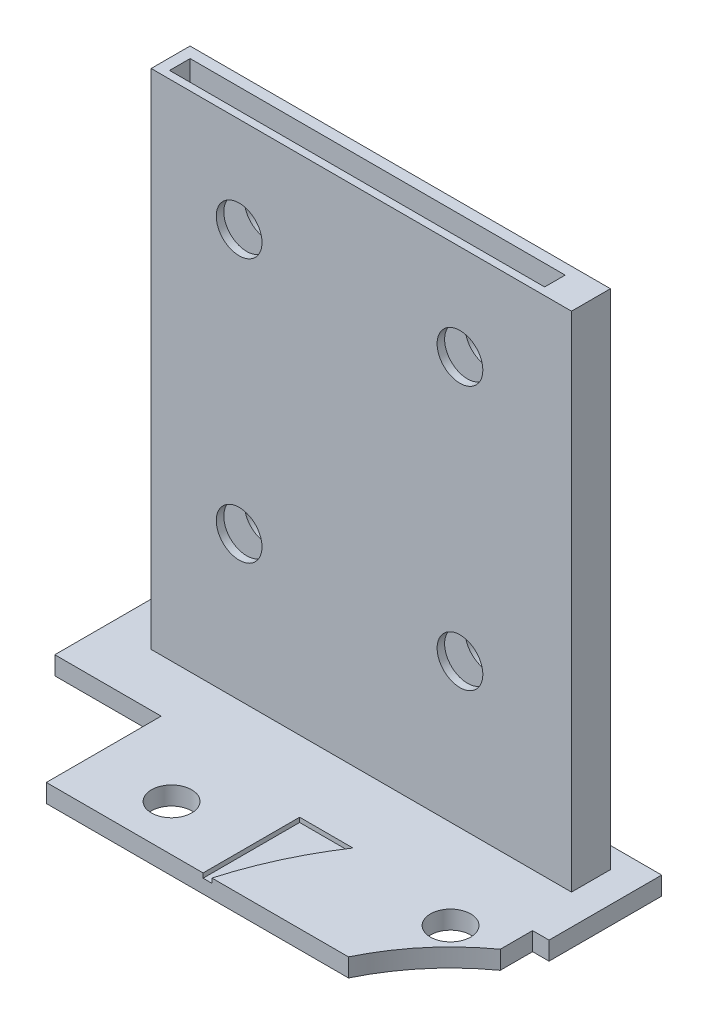
ISO-10303-21;
HEADER;
FILE_DESCRIPTION(('STEP AP214'),'2;1');
FILE_NAME('part.step','',(''),(''),'','','');
FILE_SCHEMA(('AUTOMOTIVE_DESIGN { 1 0 10303 214 1 1 1 1 }'));
ENDSEC;
DATA;
#1=APPLICATION_CONTEXT('core data for automotive mechanical design processes');
#2=APPLICATION_PROTOCOL_DEFINITION('international standard','automotive_design',2000,#1);
#3=PRODUCT_CONTEXT('',#1,'mechanical');
#4=PRODUCT('Part','Part','',(#3));
#5=PRODUCT_RELATED_PRODUCT_CATEGORY('part','',(#4));
#6=PRODUCT_DEFINITION_FORMATION('','',#4);
#7=PRODUCT_DEFINITION_CONTEXT('part definition',#1,'design');
#8=PRODUCT_DEFINITION('design','',#6,#7);
#9=PRODUCT_DEFINITION_SHAPE('','',#8);
#10=(LENGTH_UNIT() NAMED_UNIT(*) SI_UNIT(.MILLI.,.METRE.));
#11=(NAMED_UNIT(*) PLANE_ANGLE_UNIT() SI_UNIT($,.RADIAN.));
#12=(NAMED_UNIT(*) SI_UNIT($,.STERADIAN.) SOLID_ANGLE_UNIT());
#13=UNCERTAINTY_MEASURE_WITH_UNIT(LENGTH_MEASURE(1.E-05),#10,'distance_accuracy_value','');
#14=(GEOMETRIC_REPRESENTATION_CONTEXT(3) GLOBAL_UNCERTAINTY_ASSIGNED_CONTEXT((#13)) GLOBAL_UNIT_ASSIGNED_CONTEXT((#10,
#11,#12)) REPRESENTATION_CONTEXT('',''));
#15=CARTESIAN_POINT('',(0.,0.,0.));
#16=DIRECTION('',(0.,0.,1.));
#17=DIRECTION('',(1.,0.,0.));
#18=AXIS2_PLACEMENT_3D('',#15,#16,#17);
#19=CARTESIAN_POINT('',(3.,2.,0.));
#20=DIRECTION('',(0.,1.,0.));
#21=DIRECTION('',(0.,0.,1.));
#22=AXIS2_PLACEMENT_3D('',#19,#20,#21);
#23=PLANE('',#22);
#24=CARTESIAN_POINT('',(15.5,2.,-15.5));
#25=DIRECTION('',(0.,1.,0.));
#26=DIRECTION('',(0.,0.,1.));
#27=AXIS2_PLACEMENT_3D('',#24,#25,#26);
#28=CIRCLE('',#27,2.2);
#29=CARTESIAN_POINT('',(15.5,2.,-13.3));
#30=VERTEX_POINT('',#29);
#31=EDGE_CURVE('E53',#30,#30,#28,.T.);
#32=ORIENTED_EDGE('',*,*,#31,.F.);
#33=EDGE_LOOP('',(#32));
#34=FACE_BOUND('',#33,.T.);
#35=CARTESIAN_POINT('',(42.5,2.,-19.));
#36=DIRECTION('',(0.,1.,0.));
#37=DIRECTION('',(0.,0.,1.));
#38=AXIS2_PLACEMENT_3D('',#35,#36,#37);
#39=CIRCLE('',#38,2.2);
#40=CARTESIAN_POINT('',(42.5,2.,-16.8));
#41=VERTEX_POINT('',#40);
#42=EDGE_CURVE('E353',#41,#41,#39,.T.);
#43=ORIENTED_EDGE('',*,*,#42,.F.);
#44=EDGE_LOOP('',(#43));
#45=FACE_BOUND('',#44,.T.);
#46=DIRECTION('',(0.,0.,1.));
#47=VECTOR('',#46,1.);
#48=CARTESIAN_POINT('',(47.4659600941924,2.,-35.3135345713538));
#49=LINE('',#48,#47);
#50=CARTESIAN_POINT('',(47.4659600941924,2.,-23.));
#51=VERTEX_POINT('',#50);
#52=CARTESIAN_POINT('',(47.4659600941924,2.,-19.4690966385757));
#53=VERTEX_POINT('',#52);
#54=EDGE_CURVE('E295',#51,#53,#49,.T.);
#55=ORIENTED_EDGE('',*,*,#54,.F.);
#56=DIRECTION('',(1.,0.,0.));
#57=VECTOR('',#56,1.);
#58=CARTESIAN_POINT('',(6.86192523723633,2.,-23.));
#59=LINE('',#58,#57);
#60=CARTESIAN_POINT('',(49.26519911665,2.,-23.));
#61=VERTEX_POINT('',#60);
#62=EDGE_CURVE('E279',#51,#61,#59,.T.);
#63=ORIENTED_EDGE('',*,*,#62,.T.);
#64=DIRECTION('',(0.,0.,-1.));
#65=VECTOR('',#64,1.);
#66=CARTESIAN_POINT('',(49.26519911665,2.,-23.));
#67=LINE('',#66,#65);
#68=CARTESIAN_POINT('',(49.26519911665,2.,-35.3135345713538));
#69=VERTEX_POINT('',#68);
#70=EDGE_CURVE('E258',#61,#69,#67,.T.);
#71=ORIENTED_EDGE('',*,*,#70,.T.);
#72=DIRECTION('',(-1.,0.,0.));
#73=VECTOR('',#72,1.);
#74=CARTESIAN_POINT('',(47.4659600941924,2.,-35.3135345713538));
#75=LINE('',#74,#73);
#76=CARTESIAN_POINT('',(-4.76341799432753,2.,-35.3135345713538));
#77=VERTEX_POINT('',#76);
#78=EDGE_CURVE('E274',#69,#77,#75,.T.);
#79=ORIENTED_EDGE('',*,*,#78,.T.);
#80=DIRECTION('',(0.,0.,1.));
#81=VECTOR('',#80,1.);
#82=CARTESIAN_POINT('',(-4.76341799432753,2.,-35.3135345713538));
#83=LINE('',#82,#81);
#84=CARTESIAN_POINT('',(-4.76341799432753,2.,-23.));
#85=VERTEX_POINT('',#84);
#86=EDGE_CURVE('E276',#77,#85,#83,.T.);
#87=ORIENTED_EDGE('',*,*,#86,.T.);
#88=CARTESIAN_POINT('',(6.86192523723633,2.,-23.));
#89=VERTEX_POINT('',#88);
#90=EDGE_CURVE('E280',#85,#89,#59,.T.);
#91=ORIENTED_EDGE('',*,*,#90,.T.);
#92=DIRECTION('',(0.,0.,-1.));
#93=VECTOR('',#92,1.);
#94=CARTESIAN_POINT('',(6.86192523723633,2.,-10.4481568727972));
#95=LINE('',#94,#93);
#96=CARTESIAN_POINT('',(6.86192523723633,2.,-10.4481568727972));
#97=VERTEX_POINT('',#96);
#98=EDGE_CURVE('E301',#97,#89,#95,.T.);
#99=ORIENTED_EDGE('',*,*,#98,.F.);
#100=DIRECTION('',(-1.,0.,0.));
#101=VECTOR('',#100,1.);
#102=CARTESIAN_POINT('',(47.4659600941924,2.,-10.4481568727972));
#103=LINE('',#102,#101);
#104=CARTESIAN_POINT('',(24.,2.,-10.4481568727972));
#105=VERTEX_POINT('',#104);
#106=EDGE_CURVE('E297',#105,#97,#103,.T.);
#107=ORIENTED_EDGE('',*,*,#106,.F.);
#108=DIRECTION('',(0.,0.,-1.));
#109=VECTOR('',#108,1.);
#110=CARTESIAN_POINT('',(24.,2.,-25.8416358230333));
#111=LINE('',#110,#109);
#112=CARTESIAN_POINT('',(24.,2.,-21.));
#113=VERTEX_POINT('',#112);
#114=EDGE_CURVE('E333',#105,#113,#111,.T.);
#115=ORIENTED_EDGE('',*,*,#114,.T.);
#116=DIRECTION('',(1.,0.,0.));
#117=VECTOR('',#116,1.);
#118=CARTESIAN_POINT('',(11.8171021910919,2.,-21.));
#119=LINE('',#118,#117);
#120=CARTESIAN_POINT('',(29.8298247557738,2.,-21.));
#121=VERTEX_POINT('',#120);
#122=EDGE_CURVE('E335',#113,#121,#119,.T.);
#123=ORIENTED_EDGE('',*,*,#122,.T.);
#124=CARTESIAN_POINT('',(61.5,2.,0.));
#125=DIRECTION('',(0.,1.,0.));
#126=DIRECTION('',(0.,0.,1.));
#127=AXIS2_PLACEMENT_3D('',#124,#125,#126);
#128=CIRCLE('',#127,38.);
#129=CARTESIAN_POINT('',(24.9645922704916,2.,-10.4481568727972));
#130=VERTEX_POINT('',#129);
#131=EDGE_CURVE('E328',#121,#130,#128,.T.);
#132=ORIENTED_EDGE('',*,*,#131,.T.);
#133=CARTESIAN_POINT('',(39.8936116400399,2.,-10.4481568727972));
#134=VERTEX_POINT('',#133);
#135=EDGE_CURVE('E300',#134,#130,#103,.T.);
#136=ORIENTED_EDGE('',*,*,#135,.F.);
#137=CARTESIAN_POINT('',(61.5,2.,0.));
#138=DIRECTION('',(0.,1.,0.));
#139=DIRECTION('',(0.,0.,1.));
#140=AXIS2_PLACEMENT_3D('',#137,#138,#139);
#141=CIRCLE('',#140,24.);
#142=EDGE_CURVE('E339',#53,#134,#141,.T.);
#143=ORIENTED_EDGE('',*,*,#142,.F.);
#144=EDGE_LOOP('',(#55,#63,#71,#79,#87,#91,#99,#107,#115,#123,#132,#136,#143));
#145=FACE_BOUND('',#144,.T.);
#146=DIRECTION('',(1.,0.,0.));
#147=VECTOR('',#146,1.);
#148=CARTESIAN_POINT('',(45.9530538750969,2.,-28.7697129723269));
#149=LINE('',#148,#147);
#150=CARTESIAN_POINT('',(0.,2.,-28.7697129723269));
#151=VERTEX_POINT('',#150);
#152=CARTESIAN_POINT('',(45.9530538750969,2.,-28.7697129723269));
#153=VERTEX_POINT('',#152);
#154=EDGE_CURVE('E245',#151,#153,#149,.T.);
#155=ORIENTED_EDGE('',*,*,#154,.F.);
#156=DIRECTION('',(0.,0.,1.));
#157=VECTOR('',#156,1.);
#158=CARTESIAN_POINT('',(0.,2.,-28.7697129723269));
#159=LINE('',#158,#157);
#160=CARTESIAN_POINT('',(0.,2.,-33.0226542261013));
#161=VERTEX_POINT('',#160);
#162=EDGE_CURVE('E208',#161,#151,#159,.T.);
#163=ORIENTED_EDGE('',*,*,#162,.F.);
#164=DIRECTION('',(-1.,0.,0.));
#165=VECTOR('',#164,1.);
#166=CARTESIAN_POINT('',(0.,2.,-33.0226542261013));
#167=LINE('',#166,#165);
#168=CARTESIAN_POINT('',(45.9530538750969,2.,-33.0226542261013));
#169=VERTEX_POINT('',#168);
#170=EDGE_CURVE('E236',#169,#161,#167,.T.);
#171=ORIENTED_EDGE('',*,*,#170,.F.);
#172=DIRECTION('',(0.,0.,-1.));
#173=VECTOR('',#172,1.);
#174=CARTESIAN_POINT('',(45.9530538750969,2.,-33.0226542261013));
#175=LINE('',#174,#173);
#176=EDGE_CURVE('E247',#153,#169,#175,.T.);
#177=ORIENTED_EDGE('',*,*,#176,.F.);
#178=EDGE_LOOP('',(#155,#163,#171,#177));
#179=FACE_BOUND('',#178,.T.);
#180=ADVANCED_FACE('F44',(#34,#45,#145,#179),#23,.T.);
#181=CARTESIAN_POINT('',(3.,0.,0.));
#182=DIRECTION('',(0.,1.,0.));
#183=DIRECTION('',(0.,0.,1.));
#184=AXIS2_PLACEMENT_3D('',#181,#182,#183);
#185=PLANE('',#184);
#186=DIRECTION('',(0.,0.,-1.));
#187=VECTOR('',#186,1.);
#188=CARTESIAN_POINT('',(6.86192523723633,0.,0.));
#189=LINE('',#188,#187);
#190=CARTESIAN_POINT('',(6.86192523723633,0.,-10.4481568727972));
#191=VERTEX_POINT('',#190);
#192=CARTESIAN_POINT('',(6.86192523723633,0.,-23.));
#193=VERTEX_POINT('',#192);
#194=EDGE_CURVE('E320',#191,#193,#189,.T.);
#195=ORIENTED_EDGE('',*,*,#194,.T.);
#196=DIRECTION('',(1.,0.,0.));
#197=VECTOR('',#196,1.);
#198=CARTESIAN_POINT('',(6.86192523723633,0.,-23.));
#199=LINE('',#198,#197);
#200=CARTESIAN_POINT('',(-4.76341799432753,0.,-23.));
#201=VERTEX_POINT('',#200);
#202=EDGE_CURVE('E259',#201,#193,#199,.T.);
#203=ORIENTED_EDGE('',*,*,#202,.F.);
#204=DIRECTION('',(0.,0.,1.));
#205=VECTOR('',#204,1.);
#206=CARTESIAN_POINT('',(-4.76341799432753,0.,-35.3135345713538));
#207=LINE('',#206,#205);
#208=CARTESIAN_POINT('',(-4.76341799432753,0.,-35.3135345713538));
#209=VERTEX_POINT('',#208);
#210=EDGE_CURVE('E268',#209,#201,#207,.T.);
#211=ORIENTED_EDGE('',*,*,#210,.F.);
#212=DIRECTION('',(-1.,0.,0.));
#213=VECTOR('',#212,1.);
#214=CARTESIAN_POINT('',(49.26519911665,0.,-35.3135345713538));
#215=LINE('',#214,#213);
#216=CARTESIAN_POINT('',(49.26519911665,0.,-35.3135345713538));
#217=VERTEX_POINT('',#216);
#218=EDGE_CURVE('E266',#217,#209,#215,.T.);
#219=ORIENTED_EDGE('',*,*,#218,.F.);
#220=DIRECTION('',(0.,0.,-1.));
#221=VECTOR('',#220,1.);
#222=CARTESIAN_POINT('',(49.26519911665,0.,-23.));
#223=LINE('',#222,#221);
#224=CARTESIAN_POINT('',(49.26519911665,0.,-23.));
#225=VERTEX_POINT('',#224);
#226=EDGE_CURVE('E262',#225,#217,#223,.T.);
#227=ORIENTED_EDGE('',*,*,#226,.F.);
#228=CARTESIAN_POINT('',(47.4659600941924,0.,-23.));
#229=VERTEX_POINT('',#228);
#230=EDGE_CURVE('E263',#229,#225,#199,.T.);
#231=ORIENTED_EDGE('',*,*,#230,.F.);
#232=DIRECTION('',(0.,0.,1.));
#233=VECTOR('',#232,1.);
#234=CARTESIAN_POINT('',(47.4659600941924,0.,0.));
#235=LINE('',#234,#233);
#236=CARTESIAN_POINT('',(47.4659600941924,0.,-19.4690966385757));
#237=VERTEX_POINT('',#236);
#238=EDGE_CURVE('E322',#229,#237,#235,.T.);
#239=ORIENTED_EDGE('',*,*,#238,.T.);
#240=CARTESIAN_POINT('',(61.5,0.,0.));
#241=DIRECTION('',(0.,1.,0.));
#242=DIRECTION('',(0.,0.,1.));
#243=AXIS2_PLACEMENT_3D('',#240,#241,#242);
#244=CIRCLE('',#243,24.);
#245=CARTESIAN_POINT('',(39.8936116400399,0.,-10.4481568727972));
#246=VERTEX_POINT('',#245);
#247=EDGE_CURVE('E324',#237,#246,#244,.T.);
#248=ORIENTED_EDGE('',*,*,#247,.T.);
#249=DIRECTION('',(-1.,0.,0.));
#250=VECTOR('',#249,1.);
#251=CARTESIAN_POINT('',(3.,0.,-10.4481568727972));
#252=LINE('',#251,#250);
#253=EDGE_CURVE('E317',#246,#191,#252,.T.);
#254=ORIENTED_EDGE('',*,*,#253,.T.);
#255=EDGE_LOOP('',(#195,#203,#211,#219,#227,#231,#239,#248,#254));
#256=FACE_BOUND('',#255,.T.);
#257=CARTESIAN_POINT('',(42.5,0.,-19.));
#258=DIRECTION('',(0.,1.,0.));
#259=DIRECTION('',(0.,0.,1.));
#260=AXIS2_PLACEMENT_3D('',#257,#258,#259);
#261=CIRCLE('',#260,2.2);
#262=CARTESIAN_POINT('',(42.5,0.,-16.8));
#263=VERTEX_POINT('',#262);
#264=EDGE_CURVE('E329',#263,#263,#261,.T.);
#265=ORIENTED_EDGE('',*,*,#264,.T.);
#266=EDGE_LOOP('',(#265));
#267=FACE_BOUND('',#266,.T.);
#268=CARTESIAN_POINT('',(15.5,0.,-15.5));
#269=DIRECTION('',(0.,1.,0.));
#270=DIRECTION('',(0.,0.,1.));
#271=AXIS2_PLACEMENT_3D('',#268,#269,#270);
#272=CIRCLE('',#271,2.2);
#273=CARTESIAN_POINT('',(15.5,0.,-13.3));
#274=VERTEX_POINT('',#273);
#275=EDGE_CURVE('E325',#274,#274,#272,.T.);
#276=ORIENTED_EDGE('',*,*,#275,.T.);
#277=EDGE_LOOP('',(#276));
#278=FACE_BOUND('',#277,.T.);
#279=ADVANCED_FACE('F419',(#256,#267,#278),#185,.F.);
#280=CARTESIAN_POINT('',(42.5,0.,-19.));
#281=DIRECTION('',(0.,1.,0.));
#282=DIRECTION('',(0.,0.,1.));
#283=AXIS2_PLACEMENT_3D('',#280,#281,#282);
#284=CYLINDRICAL_SURFACE('',#283,2.2);
#285=ORIENTED_EDGE('',*,*,#264,.F.);
#286=EDGE_LOOP('',(#285));
#287=FACE_BOUND('',#286,.T.);
#288=ORIENTED_EDGE('',*,*,#42,.T.);
#289=EDGE_LOOP('',(#288));
#290=FACE_BOUND('',#289,.T.);
#291=ADVANCED_FACE('F428',(#287,#290),#284,.F.);
#292=CARTESIAN_POINT('',(61.5,2.,0.));
#293=DIRECTION('',(0.,-1.,0.));
#294=DIRECTION('',(0.,0.,-1.));
#295=AXIS2_PLACEMENT_3D('',#292,#293,#294);
#296=CYLINDRICAL_SURFACE('',#295,24.);
#297=DIRECTION('',(0.,-1.,0.));
#298=VECTOR('',#297,1.);
#299=CARTESIAN_POINT('',(39.8936116400399,2.,-10.4481568727972));
#300=LINE('',#299,#298);
#301=EDGE_CURVE('E315',#246,#134,#300,.F.);
#302=ORIENTED_EDGE('',*,*,#301,.F.);
#303=ORIENTED_EDGE('',*,*,#247,.F.);
#304=DIRECTION('',(0.,-1.,0.));
#305=VECTOR('',#304,1.);
#306=CARTESIAN_POINT('',(47.4659600941924,2.,-19.4690966385757));
#307=LINE('',#306,#305);
#308=EDGE_CURVE('E12',#53,#237,#307,.T.);
#309=ORIENTED_EDGE('',*,*,#308,.F.);
#310=ORIENTED_EDGE('',*,*,#142,.T.);
#311=EDGE_LOOP('',(#302,#303,#309,#310));
#312=FACE_BOUND('',#311,.T.);
#313=ADVANCED_FACE('F521',(#312),#296,.F.);
#314=CARTESIAN_POINT('',(61.5,2.,0.));
#315=DIRECTION('',(0.,-1.,0.));
#316=DIRECTION('',(0.,0.,-1.));
#317=AXIS2_PLACEMENT_3D('',#314,#315,#316);
#318=CYLINDRICAL_SURFACE('',#317,38.);
#319=CARTESIAN_POINT('',(61.5,1.5,0.));
#320=DIRECTION('',(0.,1.,0.));
#321=DIRECTION('',(0.,0.,1.));
#322=AXIS2_PLACEMENT_3D('',#319,#320,#321);
#323=CIRCLE('',#322,38.);
#324=CARTESIAN_POINT('',(24.9645922704916,1.5,-10.4481568727972));
#325=VERTEX_POINT('',#324);
#326=CARTESIAN_POINT('',(29.8298247557738,1.5,-21.));
#327=VERTEX_POINT('',#326);
#328=EDGE_CURVE('E336',#325,#327,#323,.F.);
#329=ORIENTED_EDGE('',*,*,#328,.F.);
#330=DIRECTION('',(0.,-1.,0.));
#331=VECTOR('',#330,1.);
#332=CARTESIAN_POINT('',(24.9645922704916,2.,-10.4481568727972));
#333=LINE('',#332,#331);
#334=EDGE_CURVE('E312',#325,#130,#333,.F.);
#335=ORIENTED_EDGE('',*,*,#334,.T.);
#336=ORIENTED_EDGE('',*,*,#131,.F.);
#337=DIRECTION('',(0.,1.,0.));
#338=VECTOR('',#337,1.);
#339=CARTESIAN_POINT('',(29.8298247557738,0.,-21.));
#340=LINE('',#339,#338);
#341=EDGE_CURVE('E343',#327,#121,#340,.T.);
#342=ORIENTED_EDGE('',*,*,#341,.F.);
#343=EDGE_LOOP('',(#329,#335,#336,#342));
#344=FACE_BOUND('',#343,.T.);
#345=ADVANCED_FACE('F527',(#344),#318,.T.);
#346=CARTESIAN_POINT('',(3.,1.5,0.));
#347=DIRECTION('',(0.,1.,0.));
#348=DIRECTION('',(0.,0.,1.));
#349=AXIS2_PLACEMENT_3D('',#346,#347,#348);
#350=PLANE('',#349);
#351=DIRECTION('',(-1.,0.,0.));
#352=VECTOR('',#351,1.);
#353=CARTESIAN_POINT('',(3.,1.5,-10.4481568727972));
#354=LINE('',#353,#352);
#355=CARTESIAN_POINT('',(24.,1.5,-10.4481568727972));
#356=VERTEX_POINT('',#355);
#357=EDGE_CURVE('E310',#325,#356,#354,.T.);
#358=ORIENTED_EDGE('',*,*,#357,.F.);
#359=ORIENTED_EDGE('',*,*,#328,.T.);
#360=DIRECTION('',(-1.,0.,0.));
#361=VECTOR('',#360,1.);
#362=CARTESIAN_POINT('',(11.6922592846569,1.5,-21.));
#363=LINE('',#362,#361);
#364=CARTESIAN_POINT('',(24.,1.5,-21.));
#365=VERTEX_POINT('',#364);
#366=EDGE_CURVE('E338',#327,#365,#363,.T.);
#367=ORIENTED_EDGE('',*,*,#366,.T.);
#368=DIRECTION('',(0.,0.,-1.));
#369=VECTOR('',#368,1.);
#370=CARTESIAN_POINT('',(24.,1.5,-21.));
#371=LINE('',#370,#369);
#372=EDGE_CURVE('E332',#356,#365,#371,.T.);
#373=ORIENTED_EDGE('',*,*,#372,.F.);
#374=EDGE_LOOP('',(#358,#359,#367,#373));
#375=FACE_BOUND('',#374,.T.);
#376=ADVANCED_FACE('F517',(#375),#350,.T.);
#377=CARTESIAN_POINT('',(11.8171021910919,0.,-21.));
#378=DIRECTION('',(0.,0.,1.));
#379=DIRECTION('',(1.,0.,0.));
#380=AXIS2_PLACEMENT_3D('',#377,#378,#379);
#381=PLANE('',#380);
#382=DIRECTION('',(0.,-1.,0.));
#383=VECTOR('',#382,1.);
#384=CARTESIAN_POINT('',(24.,2.,-21.));
#385=LINE('',#384,#383);
#386=EDGE_CURVE('E340',#113,#365,#385,.T.);
#387=ORIENTED_EDGE('',*,*,#386,.T.);
#388=ORIENTED_EDGE('',*,*,#366,.F.);
#389=ORIENTED_EDGE('',*,*,#341,.T.);
#390=ORIENTED_EDGE('',*,*,#122,.F.);
#391=EDGE_LOOP('',(#387,#388,#389,#390));
#392=FACE_BOUND('',#391,.T.);
#393=ADVANCED_FACE('F46',(#392),#381,.T.);
#394=CARTESIAN_POINT('',(24.,-1.,-25.8416358230333));
#395=DIRECTION('',(1.,0.,0.));
#396=DIRECTION('',(0.,0.,-1.));
#397=AXIS2_PLACEMENT_3D('',#394,#395,#396);
#398=PLANE('',#397);
#399=DIRECTION('',(0.,1.,0.));
#400=VECTOR('',#399,1.);
#401=CARTESIAN_POINT('',(24.,-1.,-10.4481568727972));
#402=LINE('',#401,#400);
#403=EDGE_CURVE('E307',#356,#105,#402,.T.);
#404=ORIENTED_EDGE('',*,*,#403,.F.);
#405=ORIENTED_EDGE('',*,*,#372,.T.);
#406=ORIENTED_EDGE('',*,*,#386,.F.);
#407=ORIENTED_EDGE('',*,*,#114,.F.);
#408=EDGE_LOOP('',(#404,#405,#406,#407));
#409=FACE_BOUND('',#408,.T.);
#410=ADVANCED_FACE('F508',(#409),#398,.T.);
#411=CARTESIAN_POINT('',(15.5,0.,-15.5));
#412=DIRECTION('',(0.,1.,0.));
#413=DIRECTION('',(0.,0.,1.));
#414=AXIS2_PLACEMENT_3D('',#411,#412,#413);
#415=CYLINDRICAL_SURFACE('',#414,2.2);
#416=ORIENTED_EDGE('',*,*,#275,.F.);
#417=EDGE_LOOP('',(#416));
#418=FACE_BOUND('',#417,.T.);
#419=ORIENTED_EDGE('',*,*,#31,.T.);
#420=EDGE_LOOP('',(#419));
#421=FACE_BOUND('',#420,.T.);
#422=ADVANCED_FACE('F498',(#418,#421),#415,.F.);
#423=CARTESIAN_POINT('',(6.86192523723633,-40.0280153353467,-10.4481568727972));
#424=DIRECTION('',(1.,0.,0.));
#425=DIRECTION('',(0.,0.,-1.));
#426=AXIS2_PLACEMENT_3D('',#423,#424,#425);
#427=PLANE('',#426);
#428=DIRECTION('',(0.,1.,0.));
#429=VECTOR('',#428,1.);
#430=CARTESIAN_POINT('',(6.86192523723633,-40.0280153353467,-23.));
#431=LINE('',#430,#429);
#432=EDGE_CURVE('E304',#193,#89,#431,.T.);
#433=ORIENTED_EDGE('',*,*,#432,.F.);
#434=ORIENTED_EDGE('',*,*,#194,.F.);
#435=DIRECTION('',(0.,1.,0.));
#436=VECTOR('',#435,1.);
#437=CARTESIAN_POINT('',(6.86192523723633,-40.0280153353467,-10.4481568727972));
#438=LINE('',#437,#436);
#439=EDGE_CURVE('E303',#191,#97,#438,.T.);
#440=ORIENTED_EDGE('',*,*,#439,.T.);
#441=ORIENTED_EDGE('',*,*,#98,.T.);
#442=EDGE_LOOP('',(#433,#434,#440,#441));
#443=FACE_BOUND('',#442,.T.);
#444=ADVANCED_FACE('F494',(#443),#427,.F.);
#445=CARTESIAN_POINT('',(47.4659600941924,-40.0280153353467,-10.4481568727972));
#446=DIRECTION('',(0.,0.,-1.));
#447=DIRECTION('',(-1.,0.,0.));
#448=AXIS2_PLACEMENT_3D('',#445,#446,#447);
#449=PLANE('',#448);
#450=ORIENTED_EDGE('',*,*,#301,.T.);
#451=ORIENTED_EDGE('',*,*,#135,.T.);
#452=ORIENTED_EDGE('',*,*,#334,.F.);
#453=ORIENTED_EDGE('',*,*,#357,.T.);
#454=ORIENTED_EDGE('',*,*,#403,.T.);
#455=ORIENTED_EDGE('',*,*,#106,.T.);
#456=ORIENTED_EDGE('',*,*,#439,.F.);
#457=ORIENTED_EDGE('',*,*,#253,.F.);
#458=EDGE_LOOP('',(#450,#451,#452,#453,#454,#455,#456,#457));
#459=FACE_BOUND('',#458,.T.);
#460=ADVANCED_FACE('F497',(#459),#449,.F.);
#461=CARTESIAN_POINT('',(47.4659600941924,-40.0280153353467,-35.3135345713538));
#462=DIRECTION('',(-1.,0.,0.));
#463=DIRECTION('',(0.,0.,1.));
#464=AXIS2_PLACEMENT_3D('',#461,#462,#463);
#465=PLANE('',#464);
#466=ORIENTED_EDGE('',*,*,#238,.F.);
#467=DIRECTION('',(0.,1.,0.));
#468=VECTOR('',#467,1.);
#469=CARTESIAN_POINT('',(47.4659600941924,-40.0280153353467,-23.));
#470=LINE('',#469,#468);
#471=EDGE_CURVE('E285',#229,#51,#470,.T.);
#472=ORIENTED_EDGE('',*,*,#471,.T.);
#473=ORIENTED_EDGE('',*,*,#54,.T.);
#474=ORIENTED_EDGE('',*,*,#308,.T.);
#475=EDGE_LOOP('',(#466,#472,#473,#474));
#476=FACE_BOUND('',#475,.T.);
#477=ADVANCED_FACE('F489',(#476),#465,.F.);
#478=CARTESIAN_POINT('',(47.4659600941924,0.,-35.3135345713538));
#479=DIRECTION('',(0.,0.,-1.));
#480=DIRECTION('',(-1.,0.,0.));
#481=AXIS2_PLACEMENT_3D('',#478,#479,#480);
#482=PLANE('',#481);
#483=ORIENTED_EDGE('',*,*,#218,.T.);
#484=DIRECTION('',(0.,1.,0.));
#485=VECTOR('',#484,1.);
#486=CARTESIAN_POINT('',(-4.76341799432753,0.,-35.3135345713538));
#487=LINE('',#486,#485);
#488=EDGE_CURVE('E286',#209,#77,#487,.T.);
#489=ORIENTED_EDGE('',*,*,#488,.T.);
#490=ORIENTED_EDGE('',*,*,#78,.F.);
#491=DIRECTION('',(0.,1.,0.));
#492=VECTOR('',#491,1.);
#493=CARTESIAN_POINT('',(49.26519911665,0.,-35.3135345713538));
#494=LINE('',#493,#492);
#495=EDGE_CURVE('E289',#217,#69,#494,.T.);
#496=ORIENTED_EDGE('',*,*,#495,.F.);
#497=EDGE_LOOP('',(#483,#489,#490,#496));
#498=FACE_BOUND('',#497,.T.);
#499=ADVANCED_FACE('F481',(#498),#482,.T.);
#500=CARTESIAN_POINT('',(6.86192523723633,0.,-23.));
#501=DIRECTION('',(0.,0.,1.));
#502=DIRECTION('',(1.,0.,0.));
#503=AXIS2_PLACEMENT_3D('',#500,#501,#502);
#504=PLANE('',#503);
#505=ORIENTED_EDGE('',*,*,#432,.T.);
#506=ORIENTED_EDGE('',*,*,#90,.F.);
#507=DIRECTION('',(0.,1.,0.));
#508=VECTOR('',#507,1.);
#509=CARTESIAN_POINT('',(-4.76341799432753,0.,-23.));
#510=LINE('',#509,#508);
#511=EDGE_CURVE('E283',#201,#85,#510,.T.);
#512=ORIENTED_EDGE('',*,*,#511,.F.);
#513=ORIENTED_EDGE('',*,*,#202,.T.);
#514=EDGE_LOOP('',(#505,#506,#512,#513));
#515=FACE_BOUND('',#514,.T.);
#516=ADVANCED_FACE('F477',(#515),#504,.T.);
#517=ORIENTED_EDGE('',*,*,#471,.F.);
#518=ORIENTED_EDGE('',*,*,#230,.T.);
#519=DIRECTION('',(0.,1.,0.));
#520=VECTOR('',#519,1.);
#521=CARTESIAN_POINT('',(49.26519911665,0.,-23.));
#522=LINE('',#521,#520);
#523=EDGE_CURVE('E271',#225,#61,#522,.T.);
#524=ORIENTED_EDGE('',*,*,#523,.T.);
#525=ORIENTED_EDGE('',*,*,#62,.F.);
#526=EDGE_LOOP('',(#517,#518,#524,#525));
#527=FACE_BOUND('',#526,.T.);
#528=ADVANCED_FACE('F480',(#527),#504,.T.);
#529=CARTESIAN_POINT('',(-4.76341799432753,0.,-35.3135345713538));
#530=DIRECTION('',(-1.,0.,0.));
#531=DIRECTION('',(0.,0.,1.));
#532=AXIS2_PLACEMENT_3D('',#529,#530,#531);
#533=PLANE('',#532);
#534=ORIENTED_EDGE('',*,*,#86,.F.);
#535=ORIENTED_EDGE('',*,*,#488,.F.);
#536=ORIENTED_EDGE('',*,*,#210,.T.);
#537=ORIENTED_EDGE('',*,*,#511,.T.);
#538=EDGE_LOOP('',(#534,#535,#536,#537));
#539=FACE_BOUND('',#538,.T.);
#540=ADVANCED_FACE('F483',(#539),#533,.T.);
#541=CARTESIAN_POINT('',(49.26519911665,0.,-23.));
#542=DIRECTION('',(1.,0.,0.));
#543=DIRECTION('',(0.,0.,-1.));
#544=AXIS2_PLACEMENT_3D('',#541,#542,#543);
#545=PLANE('',#544);
#546=ORIENTED_EDGE('',*,*,#70,.F.);
#547=ORIENTED_EDGE('',*,*,#523,.F.);
#548=ORIENTED_EDGE('',*,*,#226,.T.);
#549=ORIENTED_EDGE('',*,*,#495,.T.);
#550=EDGE_LOOP('',(#546,#547,#548,#549));
#551=FACE_BOUND('',#550,.T.);
#552=ADVANCED_FACE('F462',(#551),#545,.T.);
#553=CARTESIAN_POINT('',(0.,57.,0.));
#554=DIRECTION('',(0.,-1.,0.));
#555=DIRECTION('',(0.,0.,-1.));
#556=AXIS2_PLACEMENT_3D('',#553,#554,#555);
#557=PLANE('',#556);
#558=DIRECTION('',(0.,0.,1.));
#559=VECTOR('',#558,1.);
#560=CARTESIAN_POINT('',(0.,57.,-28.7697129723269));
#561=LINE('',#560,#559);
#562=CARTESIAN_POINT('',(0.,57.,-33.0226542261013));
#563=VERTEX_POINT('',#562);
#564=CARTESIAN_POINT('',(0.,57.,-28.7697129723269));
#565=VERTEX_POINT('',#564);
#566=EDGE_CURVE('E232',#563,#565,#561,.T.);
#567=ORIENTED_EDGE('',*,*,#566,.T.);
#568=DIRECTION('',(1.,0.,0.));
#569=VECTOR('',#568,1.);
#570=CARTESIAN_POINT('',(45.9530538750969,57.,-28.7697129723269));
#571=LINE('',#570,#569);
#572=CARTESIAN_POINT('',(45.9530538750969,57.,-28.7697129723269));
#573=VERTEX_POINT('',#572);
#574=EDGE_CURVE('E235',#565,#573,#571,.T.);
#575=ORIENTED_EDGE('',*,*,#574,.T.);
#576=DIRECTION('',(0.,0.,-1.));
#577=VECTOR('',#576,1.);
#578=CARTESIAN_POINT('',(45.9530538750969,57.,-33.0226542261013));
#579=LINE('',#578,#577);
#580=CARTESIAN_POINT('',(45.9530538750969,57.,-33.0226542261013));
#581=VERTEX_POINT('',#580);
#582=EDGE_CURVE('E238',#573,#581,#579,.T.);
#583=ORIENTED_EDGE('',*,*,#582,.T.);
#584=DIRECTION('',(-1.,0.,0.));
#585=VECTOR('',#584,1.);
#586=CARTESIAN_POINT('',(0.,57.,-33.0226542261013));
#587=LINE('',#586,#585);
#588=EDGE_CURVE('E240',#581,#563,#587,.T.);
#589=ORIENTED_EDGE('',*,*,#588,.T.);
#590=EDGE_LOOP('',(#567,#575,#583,#589));
#591=FACE_BOUND('',#590,.T.);
#592=DIRECTION('',(0.,0.,1.));
#593=VECTOR('',#592,1.);
#594=CARTESIAN_POINT('',(1.19259018783235,57.,-31.8374083029183));
#595=LINE('',#594,#593);
#596=CARTESIAN_POINT('',(1.19259018783235,57.,-31.8374083029183));
#597=VERTEX_POINT('',#596);
#598=CARTESIAN_POINT('',(1.19259018783235,57.,-29.590654372221));
#599=VERTEX_POINT('',#598);
#600=EDGE_CURVE('E191',#597,#599,#595,.T.);
#601=ORIENTED_EDGE('',*,*,#600,.F.);
#602=DIRECTION('',(-1.,0.,0.));
#603=VECTOR('',#602,1.);
#604=CARTESIAN_POINT('',(1.19259018783235,57.,-31.8374083029183));
#605=LINE('',#604,#603);
#606=CARTESIAN_POINT('',(42.1925901878324,57.,-31.8374083029183));
#607=VERTEX_POINT('',#606);
#608=EDGE_CURVE('E216',#607,#597,#605,.T.);
#609=ORIENTED_EDGE('',*,*,#608,.F.);
#610=DIRECTION('',(0.,0.,-1.));
#611=VECTOR('',#610,1.);
#612=CARTESIAN_POINT('',(42.1925901878324,57.,-29.590654372221));
#613=LINE('',#612,#611);
#614=CARTESIAN_POINT('',(42.1925901878324,57.,-29.590654372221));
#615=VERTEX_POINT('',#614);
#616=EDGE_CURVE('E214',#615,#607,#613,.T.);
#617=ORIENTED_EDGE('',*,*,#616,.F.);
#618=DIRECTION('',(1.,0.,0.));
#619=VECTOR('',#618,1.);
#620=CARTESIAN_POINT('',(1.19259018783235,57.,-29.590654372221));
#621=LINE('',#620,#619);
#622=EDGE_CURVE('E200',#599,#615,#621,.T.);
#623=ORIENTED_EDGE('',*,*,#622,.F.);
#624=EDGE_LOOP('',(#601,#609,#617,#623));
#625=FACE_BOUND('',#624,.T.);
#626=ADVANCED_FACE('F212',(#591,#625),#557,.F.);
#627=CARTESIAN_POINT('',(0.,57.,-28.7697129723269));
#628=DIRECTION('',(1.,0.,0.));
#629=DIRECTION('',(0.,0.,-1.));
#630=AXIS2_PLACEMENT_3D('',#627,#628,#629);
#631=PLANE('',#630);
#632=ORIENTED_EDGE('',*,*,#162,.T.);
#633=DIRECTION('',(0.,-1.,0.));
#634=VECTOR('',#633,1.);
#635=CARTESIAN_POINT('',(0.,57.,-28.7697129723269));
#636=LINE('',#635,#634);
#637=EDGE_CURVE('E256',#565,#151,#636,.T.);
#638=ORIENTED_EDGE('',*,*,#637,.F.);
#639=ORIENTED_EDGE('',*,*,#566,.F.);
#640=DIRECTION('',(0.,-1.,0.));
#641=VECTOR('',#640,1.);
#642=CARTESIAN_POINT('',(0.,57.,-33.0226542261013));
#643=LINE('',#642,#641);
#644=EDGE_CURVE('E242',#563,#161,#643,.T.);
#645=ORIENTED_EDGE('',*,*,#644,.T.);
#646=EDGE_LOOP('',(#632,#638,#639,#645));
#647=FACE_BOUND('',#646,.T.);
#648=ADVANCED_FACE('F461',(#647),#631,.F.);
#649=CARTESIAN_POINT('',(45.9530538750969,57.,-28.7697129723269));
#650=DIRECTION('',(0.,0.,-1.));
#651=DIRECTION('',(-1.,0.,0.));
#652=AXIS2_PLACEMENT_3D('',#649,#650,#651);
#653=PLANE('',#652);
#654=CARTESIAN_POINT('',(9.61854012207666,17.7609770935652,-28.7697129723269));
#655=DIRECTION('',(0.,0.,1.));
#656=DIRECTION('',(1.,0.,0.));
#657=AXIS2_PLACEMENT_3D('',#654,#655,#656);
#658=CIRCLE('',#657,2.5);
#659=CARTESIAN_POINT('',(12.1185401220767,17.7609770935652,-28.7697129723269));
#660=VERTEX_POINT('',#659);
#661=EDGE_CURVE('E1011',#660,#660,#658,.T.);
#662=ORIENTED_EDGE('',*,*,#661,.F.);
#663=EDGE_LOOP('',(#662));
#664=FACE_BOUND('',#663,.T.);
#665=CARTESIAN_POINT('',(9.61854012207666,46.5740715109579,-28.7697129723269));
#666=DIRECTION('',(0.,0.,1.));
#667=DIRECTION('',(1.,0.,0.));
#668=AXIS2_PLACEMENT_3D('',#665,#666,#667);
#669=CIRCLE('',#668,2.5);
#670=CARTESIAN_POINT('',(12.1185401220767,46.5740715109579,-28.7697129723269));
#671=VERTEX_POINT('',#670);
#672=EDGE_CURVE('E1008',#671,#671,#669,.T.);
#673=ORIENTED_EDGE('',*,*,#672,.F.);
#674=EDGE_LOOP('',(#673));
#675=FACE_BOUND('',#674,.T.);
#676=CARTESIAN_POINT('',(33.7591322494719,46.5740715109579,-28.7697129723269));
#677=DIRECTION('',(0.,0.,1.));
#678=DIRECTION('',(1.,0.,0.));
#679=AXIS2_PLACEMENT_3D('',#676,#677,#678);
#680=CIRCLE('',#679,2.5);
#681=CARTESIAN_POINT('',(36.2591322494719,46.5740715109579,-28.7697129723269));
#682=VERTEX_POINT('',#681);
#683=EDGE_CURVE('E1010',#682,#682,#680,.T.);
#684=ORIENTED_EDGE('',*,*,#683,.F.);
#685=EDGE_LOOP('',(#684));
#686=FACE_BOUND('',#685,.T.);
#687=CARTESIAN_POINT('',(33.7591322494719,17.7609770935652,-28.7697129723269));
#688=DIRECTION('',(0.,0.,1.));
#689=DIRECTION('',(1.,0.,0.));
#690=AXIS2_PLACEMENT_3D('',#687,#688,#689);
#691=CIRCLE('',#690,2.5);
#692=CARTESIAN_POINT('',(36.2591322494719,17.7609770935652,-28.7697129723269));
#693=VERTEX_POINT('',#692);
#694=EDGE_CURVE('E365',#693,#693,#691,.T.);
#695=ORIENTED_EDGE('',*,*,#694,.F.);
#696=EDGE_LOOP('',(#695));
#697=FACE_BOUND('',#696,.T.);
#698=ORIENTED_EDGE('',*,*,#154,.T.);
#699=DIRECTION('',(0.,-1.,0.));
#700=VECTOR('',#699,1.);
#701=CARTESIAN_POINT('',(45.9530538750969,57.,-28.7697129723269));
#702=LINE('',#701,#700);
#703=EDGE_CURVE('E253',#573,#153,#702,.T.);
#704=ORIENTED_EDGE('',*,*,#703,.F.);
#705=ORIENTED_EDGE('',*,*,#574,.F.);
#706=ORIENTED_EDGE('',*,*,#637,.T.);
#707=EDGE_LOOP('',(#698,#704,#705,#706));
#708=FACE_BOUND('',#707,.T.);
#709=ADVANCED_FACE('F469',(#664,#675,#686,#697,#708),#653,.F.);
#710=CARTESIAN_POINT('',(45.9530538750969,57.,-33.0226542261013));
#711=DIRECTION('',(-1.,0.,0.));
#712=DIRECTION('',(0.,0.,1.));
#713=AXIS2_PLACEMENT_3D('',#710,#711,#712);
#714=PLANE('',#713);
#715=ORIENTED_EDGE('',*,*,#176,.T.);
#716=DIRECTION('',(0.,-1.,0.));
#717=VECTOR('',#716,1.);
#718=CARTESIAN_POINT('',(45.9530538750969,57.,-33.0226542261013));
#719=LINE('',#718,#717);
#720=EDGE_CURVE('E61',#581,#169,#719,.T.);
#721=ORIENTED_EDGE('',*,*,#720,.F.);
#722=ORIENTED_EDGE('',*,*,#582,.F.);
#723=ORIENTED_EDGE('',*,*,#703,.T.);
#724=EDGE_LOOP('',(#715,#721,#722,#723));
#725=FACE_BOUND('',#724,.T.);
#726=ADVANCED_FACE('F466',(#725),#714,.F.);
#727=CARTESIAN_POINT('',(0.,57.,-33.0226542261013));
#728=DIRECTION('',(0.,0.,1.));
#729=DIRECTION('',(1.,0.,0.));
#730=AXIS2_PLACEMENT_3D('',#727,#728,#729);
#731=PLANE('',#730);
#732=CARTESIAN_POINT('',(9.61854012207666,17.7609770935652,-33.0226542261013));
#733=DIRECTION('',(0.,0.,1.));
#734=DIRECTION('',(1.,0.,0.));
#735=AXIS2_PLACEMENT_3D('',#732,#733,#734);
#736=CIRCLE('',#735,2.5);
#737=CARTESIAN_POINT('',(12.1185401220767,17.7609770935652,-33.0226542261013));
#738=VERTEX_POINT('',#737);
#739=EDGE_CURVE('E222',#738,#738,#736,.T.);
#740=ORIENTED_EDGE('',*,*,#739,.T.);
#741=EDGE_LOOP('',(#740));
#742=FACE_BOUND('',#741,.T.);
#743=CARTESIAN_POINT('',(9.61854012207666,46.5740715109579,-33.0226542261013));
#744=DIRECTION('',(0.,0.,1.));
#745=DIRECTION('',(1.,0.,0.));
#746=AXIS2_PLACEMENT_3D('',#743,#744,#745);
#747=CIRCLE('',#746,2.5);
#748=CARTESIAN_POINT('',(12.1185401220767,46.5740715109579,-33.0226542261013));
#749=VERTEX_POINT('',#748);
#750=EDGE_CURVE('E377',#749,#749,#747,.T.);
#751=ORIENTED_EDGE('',*,*,#750,.T.);
#752=EDGE_LOOP('',(#751));
#753=FACE_BOUND('',#752,.T.);
#754=CARTESIAN_POINT('',(33.7591322494719,46.5740715109579,-33.0226542261013));
#755=DIRECTION('',(0.,0.,1.));
#756=DIRECTION('',(1.,0.,0.));
#757=AXIS2_PLACEMENT_3D('',#754,#755,#756);
#758=CIRCLE('',#757,2.5);
#759=CARTESIAN_POINT('',(36.2591322494719,46.5740715109579,-33.0226542261013));
#760=VERTEX_POINT('',#759);
#761=EDGE_CURVE('E373',#760,#760,#758,.T.);
#762=ORIENTED_EDGE('',*,*,#761,.T.);
#763=EDGE_LOOP('',(#762));
#764=FACE_BOUND('',#763,.T.);
#765=CARTESIAN_POINT('',(33.7591322494719,17.7609770935652,-33.0226542261013));
#766=DIRECTION('',(0.,0.,1.));
#767=DIRECTION('',(1.,0.,0.));
#768=AXIS2_PLACEMENT_3D('',#765,#766,#767);
#769=CIRCLE('',#768,2.5);
#770=CARTESIAN_POINT('',(36.2591322494719,17.7609770935652,-33.0226542261013));
#771=VERTEX_POINT('',#770);
#772=EDGE_CURVE('E369',#771,#771,#769,.T.);
#773=ORIENTED_EDGE('',*,*,#772,.T.);
#774=EDGE_LOOP('',(#773));
#775=FACE_BOUND('',#774,.T.);
#776=ORIENTED_EDGE('',*,*,#170,.T.);
#777=ORIENTED_EDGE('',*,*,#644,.F.);
#778=ORIENTED_EDGE('',*,*,#588,.F.);
#779=ORIENTED_EDGE('',*,*,#720,.T.);
#780=EDGE_LOOP('',(#776,#777,#778,#779));
#781=FACE_BOUND('',#780,.T.);
#782=ADVANCED_FACE('F394',(#742,#753,#764,#775,#781),#731,.F.);
#783=CARTESIAN_POINT('',(1.19259018783235,57.,-31.8374083029183));
#784=DIRECTION('',(1.,0.,0.));
#785=DIRECTION('',(0.,0.,-1.));
#786=AXIS2_PLACEMENT_3D('',#783,#784,#785);
#787=PLANE('',#786);
#788=DIRECTION('',(0.,0.,1.));
#789=VECTOR('',#788,1.);
#790=CARTESIAN_POINT('',(1.19259018783235,2.,-31.8374083029183));
#791=LINE('',#790,#789);
#792=CARTESIAN_POINT('',(1.19259018783235,2.,-31.8374083029183));
#793=VERTEX_POINT('',#792);
#794=CARTESIAN_POINT('',(1.19259018783235,2.,-29.590654372221));
#795=VERTEX_POINT('',#794);
#796=EDGE_CURVE('E69',#793,#795,#791,.T.);
#797=ORIENTED_EDGE('',*,*,#796,.F.);
#798=DIRECTION('',(0.,-1.,0.));
#799=VECTOR('',#798,1.);
#800=CARTESIAN_POINT('',(1.19259018783235,57.,-31.8374083029183));
#801=LINE('',#800,#799);
#802=EDGE_CURVE('E196',#597,#793,#801,.T.);
#803=ORIENTED_EDGE('',*,*,#802,.F.);
#804=ORIENTED_EDGE('',*,*,#600,.T.);
#805=DIRECTION('',(0.,-1.,0.));
#806=VECTOR('',#805,1.);
#807=CARTESIAN_POINT('',(1.19259018783235,57.,-29.590654372221));
#808=LINE('',#807,#806);
#809=EDGE_CURVE('E194',#599,#795,#808,.T.);
#810=ORIENTED_EDGE('',*,*,#809,.T.);
#811=EDGE_LOOP('',(#797,#803,#804,#810));
#812=FACE_BOUND('',#811,.T.);
#813=ADVANCED_FACE('F193',(#812),#787,.T.);
#814=CARTESIAN_POINT('',(1.19259018783235,57.,-29.590654372221));
#815=DIRECTION('',(0.,0.,-1.));
#816=DIRECTION('',(-1.,0.,0.));
#817=AXIS2_PLACEMENT_3D('',#814,#815,#816);
#818=PLANE('',#817);
#819=CARTESIAN_POINT('',(9.61854012207666,17.7609770935652,-29.590654372221));
#820=DIRECTION('',(0.,0.,-1.));
#821=DIRECTION('',(-1.,0.,0.));
#822=AXIS2_PLACEMENT_3D('',#819,#820,#821);
#823=CIRCLE('',#822,2.5);
#824=CARTESIAN_POINT('',(7.11854012207666,17.7609770935652,-29.590654372221));
#825=VERTEX_POINT('',#824);
#826=EDGE_CURVE('E389',#825,#825,#823,.T.);
#827=ORIENTED_EDGE('',*,*,#826,.F.);
#828=EDGE_LOOP('',(#827));
#829=FACE_BOUND('',#828,.T.);
#830=CARTESIAN_POINT('',(9.61854012207666,46.5740715109579,-29.590654372221));
#831=DIRECTION('',(0.,0.,-1.));
#832=DIRECTION('',(-1.,0.,0.));
#833=AXIS2_PLACEMENT_3D('',#830,#831,#832);
#834=CIRCLE('',#833,2.5);
#835=CARTESIAN_POINT('',(7.11854012207666,46.5740715109579,-29.590654372221));
#836=VERTEX_POINT('',#835);
#837=EDGE_CURVE('E372',#836,#836,#834,.T.);
#838=ORIENTED_EDGE('',*,*,#837,.F.);
#839=EDGE_LOOP('',(#838));
#840=FACE_BOUND('',#839,.T.);
#841=CARTESIAN_POINT('',(33.7591322494719,46.5740715109579,-29.590654372221));
#842=DIRECTION('',(0.,0.,-1.));
#843=DIRECTION('',(-1.,0.,0.));
#844=AXIS2_PLACEMENT_3D('',#841,#842,#843);
#845=CIRCLE('',#844,2.5);
#846=CARTESIAN_POINT('',(31.2591322494719,46.5740715109579,-29.590654372221));
#847=VERTEX_POINT('',#846);
#848=EDGE_CURVE('E368',#847,#847,#845,.T.);
#849=ORIENTED_EDGE('',*,*,#848,.F.);
#850=EDGE_LOOP('',(#849));
#851=FACE_BOUND('',#850,.T.);
#852=CARTESIAN_POINT('',(33.7591322494719,17.7609770935652,-29.590654372221));
#853=DIRECTION('',(0.,0.,-1.));
#854=DIRECTION('',(-1.,0.,0.));
#855=AXIS2_PLACEMENT_3D('',#852,#853,#854);
#856=CIRCLE('',#855,2.5);
#857=CARTESIAN_POINT('',(31.2591322494719,17.7609770935652,-29.590654372221));
#858=VERTEX_POINT('',#857);
#859=EDGE_CURVE('E364',#858,#858,#856,.T.);
#860=ORIENTED_EDGE('',*,*,#859,.F.);
#861=EDGE_LOOP('',(#860));
#862=FACE_BOUND('',#861,.T.);
#863=DIRECTION('',(1.,0.,0.));
#864=VECTOR('',#863,1.);
#865=CARTESIAN_POINT('',(1.19259018783235,2.,-29.590654372221));
#866=LINE('',#865,#864);
#867=CARTESIAN_POINT('',(42.1925901878324,2.,-29.590654372221));
#868=VERTEX_POINT('',#867);
#869=EDGE_CURVE('E207',#795,#868,#866,.T.);
#870=ORIENTED_EDGE('',*,*,#869,.F.);
#871=ORIENTED_EDGE('',*,*,#809,.F.);
#872=ORIENTED_EDGE('',*,*,#622,.T.);
#873=DIRECTION('',(0.,-1.,0.));
#874=VECTOR('',#873,1.);
#875=CARTESIAN_POINT('',(42.1925901878324,57.,-29.590654372221));
#876=LINE('',#875,#874);
#877=EDGE_CURVE('E209',#615,#868,#876,.T.);
#878=ORIENTED_EDGE('',*,*,#877,.T.);
#879=EDGE_LOOP('',(#870,#871,#872,#878));
#880=FACE_BOUND('',#879,.T.);
#881=ADVANCED_FACE('F204',(#829,#840,#851,#862,#880),#818,.T.);
#882=CARTESIAN_POINT('',(42.1925901878324,57.,-29.590654372221));
#883=DIRECTION('',(-1.,0.,0.));
#884=DIRECTION('',(0.,0.,1.));
#885=AXIS2_PLACEMENT_3D('',#882,#883,#884);
#886=PLANE('',#885);
#887=DIRECTION('',(0.,0.,-1.));
#888=VECTOR('',#887,1.);
#889=CARTESIAN_POINT('',(42.1925901878324,2.,-29.590654372221));
#890=LINE('',#889,#888);
#891=CARTESIAN_POINT('',(42.1925901878324,2.,-31.8374083029183));
#892=VERTEX_POINT('',#891);
#893=EDGE_CURVE('E224',#868,#892,#890,.T.);
#894=ORIENTED_EDGE('',*,*,#893,.F.);
#895=ORIENTED_EDGE('',*,*,#877,.F.);
#896=ORIENTED_EDGE('',*,*,#616,.T.);
#897=DIRECTION('',(0.,-1.,0.));
#898=VECTOR('',#897,1.);
#899=CARTESIAN_POINT('',(42.1925901878324,57.,-31.8374083029183));
#900=LINE('',#899,#898);
#901=EDGE_CURVE('E228',#607,#892,#900,.T.);
#902=ORIENTED_EDGE('',*,*,#901,.T.);
#903=EDGE_LOOP('',(#894,#895,#896,#902));
#904=FACE_BOUND('',#903,.T.);
#905=ADVANCED_FACE('F443',(#904),#886,.T.);
#906=CARTESIAN_POINT('',(1.19259018783235,57.,-31.8374083029183));
#907=DIRECTION('',(0.,0.,1.));
#908=DIRECTION('',(1.,0.,0.));
#909=AXIS2_PLACEMENT_3D('',#906,#907,#908);
#910=PLANE('',#909);
#911=CARTESIAN_POINT('',(9.61854012207666,17.7609770935652,-31.8374083029183));
#912=DIRECTION('',(0.,0.,1.));
#913=DIRECTION('',(1.,0.,0.));
#914=AXIS2_PLACEMENT_3D('',#911,#912,#913);
#915=CIRCLE('',#914,2.5);
#916=CARTESIAN_POINT('',(12.1185401220767,17.7609770935652,-31.8374083029183));
#917=VERTEX_POINT('',#916);
#918=EDGE_CURVE('E48',#917,#917,#915,.T.);
#919=ORIENTED_EDGE('',*,*,#918,.F.);
#920=EDGE_LOOP('',(#919));
#921=FACE_BOUND('',#920,.T.);
#922=CARTESIAN_POINT('',(9.61854012207666,46.5740715109579,-31.8374083029183));
#923=DIRECTION('',(0.,0.,1.));
#924=DIRECTION('',(1.,0.,0.));
#925=AXIS2_PLACEMENT_3D('',#922,#923,#924);
#926=CIRCLE('',#925,2.5);
#927=CARTESIAN_POINT('',(12.1185401220767,46.5740715109579,-31.8374083029183));
#928=VERTEX_POINT('',#927);
#929=EDGE_CURVE('E370',#928,#928,#926,.T.);
#930=ORIENTED_EDGE('',*,*,#929,.F.);
#931=EDGE_LOOP('',(#930));
#932=FACE_BOUND('',#931,.T.);
#933=CARTESIAN_POINT('',(33.7591322494719,46.5740715109579,-31.8374083029183));
#934=DIRECTION('',(0.,0.,1.));
#935=DIRECTION('',(1.,0.,0.));
#936=AXIS2_PLACEMENT_3D('',#933,#934,#935);
#937=CIRCLE('',#936,2.5);
#938=CARTESIAN_POINT('',(36.2591322494719,46.5740715109579,-31.8374083029183));
#939=VERTEX_POINT('',#938);
#940=EDGE_CURVE('E366',#939,#939,#937,.T.);
#941=ORIENTED_EDGE('',*,*,#940,.F.);
#942=EDGE_LOOP('',(#941));
#943=FACE_BOUND('',#942,.T.);
#944=CARTESIAN_POINT('',(33.7591322494719,17.7609770935652,-31.8374083029183));
#945=DIRECTION('',(0.,0.,1.));
#946=DIRECTION('',(1.,0.,0.));
#947=AXIS2_PLACEMENT_3D('',#944,#945,#946);
#948=CIRCLE('',#947,2.5);
#949=CARTESIAN_POINT('',(36.2591322494719,17.7609770935652,-31.8374083029183));
#950=VERTEX_POINT('',#949);
#951=EDGE_CURVE('E361',#950,#950,#948,.T.);
#952=ORIENTED_EDGE('',*,*,#951,.F.);
#953=EDGE_LOOP('',(#952));
#954=FACE_BOUND('',#953,.T.);
#955=DIRECTION('',(-1.,0.,0.));
#956=VECTOR('',#955,1.);
#957=CARTESIAN_POINT('',(1.19259018783235,2.,-31.8374083029183));
#958=LINE('',#957,#956);
#959=EDGE_CURVE('E201',#892,#793,#958,.T.);
#960=ORIENTED_EDGE('',*,*,#959,.F.);
#961=ORIENTED_EDGE('',*,*,#901,.F.);
#962=ORIENTED_EDGE('',*,*,#608,.T.);
#963=ORIENTED_EDGE('',*,*,#802,.T.);
#964=EDGE_LOOP('',(#960,#961,#962,#963));
#965=FACE_BOUND('',#964,.T.);
#966=ADVANCED_FACE('F435',(#921,#932,#943,#954,#965),#910,.T.);
#967=ORIENTED_EDGE('',*,*,#796,.T.);
#968=ORIENTED_EDGE('',*,*,#869,.T.);
#969=ORIENTED_EDGE('',*,*,#893,.T.);
#970=ORIENTED_EDGE('',*,*,#959,.T.);
#971=EDGE_LOOP('',(#967,#968,#969,#970));
#972=FACE_BOUND('',#971,.T.);
#973=ADVANCED_FACE('F422',(#972),#23,.T.);
#974=CARTESIAN_POINT('',(33.7591322494719,17.7609770935652,-35.3135345713538));
#975=DIRECTION('',(0.,0.,1.));
#976=DIRECTION('',(1.,0.,0.));
#977=AXIS2_PLACEMENT_3D('',#974,#975,#976);
#978=CYLINDRICAL_SURFACE('',#977,2.5);
#979=ORIENTED_EDGE('',*,*,#951,.T.);
#980=EDGE_LOOP('',(#979));
#981=FACE_BOUND('',#980,.T.);
#982=ORIENTED_EDGE('',*,*,#772,.F.);
#983=EDGE_LOOP('',(#982));
#984=FACE_BOUND('',#983,.T.);
#985=ADVANCED_FACE('F411',(#981,#984),#978,.F.);
#986=CARTESIAN_POINT('',(33.7591322494719,46.5740715109579,-35.3135345713538));
#987=DIRECTION('',(0.,0.,1.));
#988=DIRECTION('',(1.,0.,0.));
#989=AXIS2_PLACEMENT_3D('',#986,#987,#988);
#990=CYLINDRICAL_SURFACE('',#989,2.5);
#991=ORIENTED_EDGE('',*,*,#940,.T.);
#992=EDGE_LOOP('',(#991));
#993=FACE_BOUND('',#992,.T.);
#994=ORIENTED_EDGE('',*,*,#761,.F.);
#995=EDGE_LOOP('',(#994));
#996=FACE_BOUND('',#995,.T.);
#997=ADVANCED_FACE('F412',(#993,#996),#990,.F.);
#998=CARTESIAN_POINT('',(9.61854012207666,46.5740715109579,-35.3135345713538));
#999=DIRECTION('',(0.,0.,1.));
#1000=DIRECTION('',(1.,0.,0.));
#1001=AXIS2_PLACEMENT_3D('',#998,#999,#1000);
#1002=CYLINDRICAL_SURFACE('',#1001,2.5);
#1003=ORIENTED_EDGE('',*,*,#929,.T.);
#1004=EDGE_LOOP('',(#1003));
#1005=FACE_BOUND('',#1004,.T.);
#1006=ORIENTED_EDGE('',*,*,#750,.F.);
#1007=EDGE_LOOP('',(#1006));
#1008=FACE_BOUND('',#1007,.T.);
#1009=ADVANCED_FACE('F400',(#1005,#1008),#1002,.F.);
#1010=CARTESIAN_POINT('',(9.61854012207666,17.7609770935652,-35.3135345713538));
#1011=DIRECTION('',(0.,0.,1.));
#1012=DIRECTION('',(1.,0.,0.));
#1013=AXIS2_PLACEMENT_3D('',#1010,#1011,#1012);
#1014=CYLINDRICAL_SURFACE('',#1013,2.5);
#1015=ORIENTED_EDGE('',*,*,#918,.T.);
#1016=EDGE_LOOP('',(#1015));
#1017=FACE_BOUND('',#1016,.T.);
#1018=ORIENTED_EDGE('',*,*,#739,.F.);
#1019=EDGE_LOOP('',(#1018));
#1020=FACE_BOUND('',#1019,.T.);
#1021=ADVANCED_FACE('F397',(#1017,#1020),#1014,.F.);
#1022=ORIENTED_EDGE('',*,*,#859,.T.);
#1023=EDGE_LOOP('',(#1022));
#1024=FACE_BOUND('',#1023,.T.);
#1025=ORIENTED_EDGE('',*,*,#694,.T.);
#1026=EDGE_LOOP('',(#1025));
#1027=FACE_BOUND('',#1026,.T.);
#1028=ADVANCED_FACE('F399',(#1024,#1027),#978,.F.);
#1029=ORIENTED_EDGE('',*,*,#848,.T.);
#1030=EDGE_LOOP('',(#1029));
#1031=FACE_BOUND('',#1030,.T.);
#1032=ORIENTED_EDGE('',*,*,#683,.T.);
#1033=EDGE_LOOP('',(#1032));
#1034=FACE_BOUND('',#1033,.T.);
#1035=ADVANCED_FACE('F408',(#1031,#1034),#990,.F.);
#1036=ORIENTED_EDGE('',*,*,#837,.T.);
#1037=EDGE_LOOP('',(#1036));
#1038=FACE_BOUND('',#1037,.T.);
#1039=ORIENTED_EDGE('',*,*,#672,.T.);
#1040=EDGE_LOOP('',(#1039));
#1041=FACE_BOUND('',#1040,.T.);
#1042=ADVANCED_FACE('F414',(#1038,#1041),#1002,.F.);
#1043=ORIENTED_EDGE('',*,*,#826,.T.);
#1044=EDGE_LOOP('',(#1043));
#1045=FACE_BOUND('',#1044,.T.);
#1046=ORIENTED_EDGE('',*,*,#661,.T.);
#1047=EDGE_LOOP('',(#1046));
#1048=FACE_BOUND('',#1047,.T.);
#1049=ADVANCED_FACE('F403',(#1045,#1048),#1014,.F.);
#1050=CLOSED_SHELL('',(#180,#279,#291,#313,#345,#376,#393,#410,#422,#444,#460,#477,#499,#516,
#528,#540,#552,#626,#648,#709,#726,#782,#813,#881,#905,#966,#973,#985,#997,#1009,#1021,#1028,
#1035,#1042,#1049));
#1051=MANIFOLD_SOLID_BREP('B2',#1050);
#1052=ADVANCED_BREP_SHAPE_REPRESENTATION('',(#18,#1051),#14);
#1053=SHAPE_DEFINITION_REPRESENTATION(#9,#1052);
ENDSEC;
END-ISO-10303-21;
